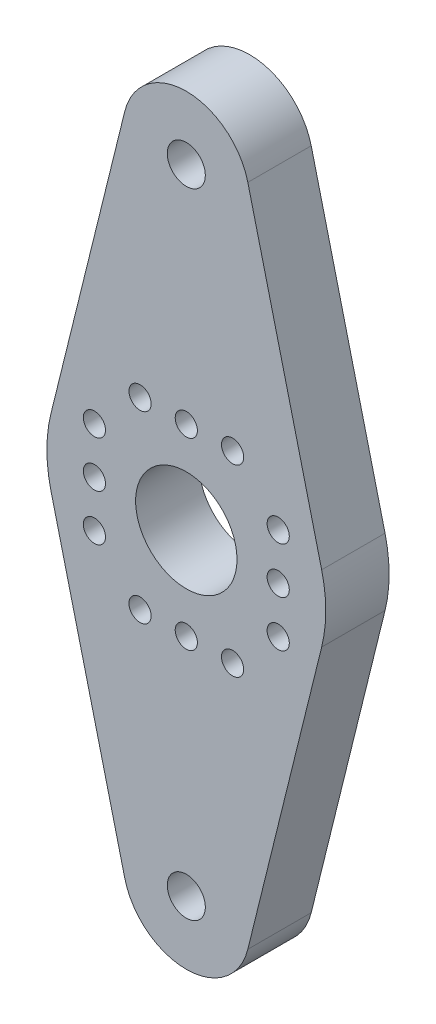
ISO-10303-21;
HEADER;
FILE_DESCRIPTION(('STEP AP214'),'2;1');
FILE_NAME('part.step','',(''),(''),'','','');
FILE_SCHEMA(('AUTOMOTIVE_DESIGN { 1 0 10303 214 1 1 1 1 }'));
ENDSEC;
DATA;
#1=APPLICATION_CONTEXT('core data for automotive mechanical design processes');
#2=APPLICATION_PROTOCOL_DEFINITION('international standard','automotive_design',2000,#1);
#3=PRODUCT_CONTEXT('',#1,'mechanical');
#4=PRODUCT('Part','Part','',(#3));
#5=PRODUCT_RELATED_PRODUCT_CATEGORY('part','',(#4));
#6=PRODUCT_DEFINITION_FORMATION('','',#4);
#7=PRODUCT_DEFINITION_CONTEXT('part definition',#1,'design');
#8=PRODUCT_DEFINITION('design','',#6,#7);
#9=PRODUCT_DEFINITION_SHAPE('','',#8);
#10=(LENGTH_UNIT() NAMED_UNIT(*) SI_UNIT(.MILLI.,.METRE.));
#11=(NAMED_UNIT(*) PLANE_ANGLE_UNIT() SI_UNIT($,.RADIAN.));
#12=(NAMED_UNIT(*) SI_UNIT($,.STERADIAN.) SOLID_ANGLE_UNIT());
#13=UNCERTAINTY_MEASURE_WITH_UNIT(LENGTH_MEASURE(1.E-05),#10,'distance_accuracy_value','');
#14=(GEOMETRIC_REPRESENTATION_CONTEXT(3) GLOBAL_UNCERTAINTY_ASSIGNED_CONTEXT((#13)) GLOBAL_UNIT_ASSIGNED_CONTEXT((#10,
#11,#12)) REPRESENTATION_CONTEXT('',''));
#15=CARTESIAN_POINT('',(0.,0.,0.));
#16=DIRECTION('',(0.,0.,1.));
#17=DIRECTION('',(1.,0.,0.));
#18=AXIS2_PLACEMENT_3D('',#15,#16,#17);
#19=CARTESIAN_POINT('',(0.,25.,5.));
#20=DIRECTION('',(0.,0.,-1.));
#21=DIRECTION('',(-1.,0.,0.));
#22=AXIS2_PLACEMENT_3D('',#19,#20,#21);
#23=PLANE('',#22);
#24=CARTESIAN_POINT('',(3.65,7.25,5.));
#25=DIRECTION('',(0.,0.,1.));
#26=DIRECTION('',(-1.,0.,0.));
#27=AXIS2_PLACEMENT_3D('',#24,#25,#26);
#28=CIRCLE('',#27,0.874999999999994);
#29=CARTESIAN_POINT('',(2.775,7.25,5.));
#30=VERTEX_POINT('',#29);
#31=EDGE_CURVE('E254',#30,#30,#28,.T.);
#32=ORIENTED_EDGE('',*,*,#31,.F.);
#33=EDGE_LOOP('',(#32));
#34=FACE_BOUND('',#33,.T.);
#35=CARTESIAN_POINT('',(0.,7.25,5.));
#36=DIRECTION('',(0.,0.,1.));
#37=DIRECTION('',(1.,0.,0.));
#38=AXIS2_PLACEMENT_3D('',#35,#36,#37);
#39=CIRCLE('',#38,0.875000000000001);
#40=CARTESIAN_POINT('',(0.875000000000077,7.25,5.));
#41=VERTEX_POINT('',#40);
#42=EDGE_CURVE('E242',#41,#41,#39,.T.);
#43=ORIENTED_EDGE('',*,*,#42,.F.);
#44=EDGE_LOOP('',(#43));
#45=FACE_BOUND('',#44,.T.);
#46=CARTESIAN_POINT('',(-7.25,-3.65,5.));
#47=DIRECTION('',(0.,0.,1.));
#48=DIRECTION('',(1.,0.,0.));
#49=AXIS2_PLACEMENT_3D('',#46,#47,#48);
#50=CIRCLE('',#49,0.874999999999999);
#51=CARTESIAN_POINT('',(-6.375,-3.65,5.));
#52=VERTEX_POINT('',#51);
#53=EDGE_CURVE('E230',#52,#52,#50,.T.);
#54=ORIENTED_EDGE('',*,*,#53,.F.);
#55=EDGE_LOOP('',(#54));
#56=FACE_BOUND('',#55,.T.);
#57=CARTESIAN_POINT('',(-3.65,-7.25,5.));
#58=DIRECTION('',(0.,0.,1.));
#59=DIRECTION('',(-1.,0.,0.));
#60=AXIS2_PLACEMENT_3D('',#57,#58,#59);
#61=CIRCLE('',#60,0.874999999999996);
#62=CARTESIAN_POINT('',(-4.525,-7.25,5.));
#63=VERTEX_POINT('',#62);
#64=EDGE_CURVE('E218',#63,#63,#61,.T.);
#65=ORIENTED_EDGE('',*,*,#64,.F.);
#66=EDGE_LOOP('',(#65));
#67=FACE_BOUND('',#66,.T.);
#68=CARTESIAN_POINT('',(0.,-7.25,5.));
#69=DIRECTION('',(0.,0.,1.));
#70=DIRECTION('',(1.,0.,0.));
#71=AXIS2_PLACEMENT_3D('',#68,#69,#70);
#72=CIRCLE('',#71,0.875);
#73=CARTESIAN_POINT('',(0.874999999999975,-7.25,5.));
#74=VERTEX_POINT('',#73);
#75=EDGE_CURVE('E206',#74,#74,#72,.T.);
#76=ORIENTED_EDGE('',*,*,#75,.F.);
#77=EDGE_LOOP('',(#76));
#78=FACE_BOUND('',#77,.T.);
#79=CARTESIAN_POINT('',(7.25,-3.65,5.));
#80=DIRECTION('',(0.,0.,1.));
#81=DIRECTION('',(-1.,0.,0.));
#82=AXIS2_PLACEMENT_3D('',#79,#80,#81);
#83=CIRCLE('',#82,0.874999999999997);
#84=CARTESIAN_POINT('',(6.375,-3.65,5.));
#85=VERTEX_POINT('',#84);
#86=EDGE_CURVE('E194',#85,#85,#83,.T.);
#87=ORIENTED_EDGE('',*,*,#86,.F.);
#88=EDGE_LOOP('',(#87));
#89=FACE_BOUND('',#88,.T.);
#90=CARTESIAN_POINT('',(7.25,0.,5.));
#91=DIRECTION('',(0.,0.,1.));
#92=DIRECTION('',(1.,0.,0.));
#93=AXIS2_PLACEMENT_3D('',#90,#91,#92);
#94=CIRCLE('',#93,0.874999999999999);
#95=CARTESIAN_POINT('',(8.125,0.,5.));
#96=VERTEX_POINT('',#95);
#97=EDGE_CURVE('E182',#96,#96,#94,.T.);
#98=ORIENTED_EDGE('',*,*,#97,.F.);
#99=EDGE_LOOP('',(#98));
#100=FACE_BOUND('',#99,.T.);
#101=CARTESIAN_POINT('',(0.,25.,5.));
#102=DIRECTION('',(0.,0.,1.));
#103=DIRECTION('',(-1.,0.,0.));
#104=AXIS2_PLACEMENT_3D('',#101,#102,#103);
#105=CIRCLE('',#104,5.);
#106=CARTESIAN_POINT('',(4.85386443980464,26.2,5.));
#107=VERTEX_POINT('',#106);
#108=CARTESIAN_POINT('',(-4.85386443980464,26.2,5.));
#109=VERTEX_POINT('',#108);
#110=EDGE_CURVE('E145',#107,#109,#105,.T.);
#111=ORIENTED_EDGE('',*,*,#110,.T.);
#112=DIRECTION('',(-0.24,-0.970772887960928,0.));
#113=VECTOR('',#112,1.);
#114=CARTESIAN_POINT('',(-10.6785017675702,2.64,5.));
#115=LINE('',#114,#113);
#116=CARTESIAN_POINT('',(-10.6785017675702,2.64,5.));
#117=VERTEX_POINT('',#116);
#118=EDGE_CURVE('E93',#109,#117,#115,.T.);
#119=ORIENTED_EDGE('',*,*,#118,.T.);
#120=CARTESIAN_POINT('',(0.,0.,5.));
#121=DIRECTION('',(0.,0.,1.));
#122=DIRECTION('',(-1.,0.,0.));
#123=AXIS2_PLACEMENT_3D('',#120,#121,#122);
#124=CIRCLE('',#123,11.);
#125=CARTESIAN_POINT('',(-10.6785017675702,-2.64,5.));
#126=VERTEX_POINT('',#125);
#127=EDGE_CURVE('E160',#117,#126,#124,.T.);
#128=ORIENTED_EDGE('',*,*,#127,.T.);
#129=DIRECTION('',(0.24,-0.970772887960928,0.));
#130=VECTOR('',#129,1.);
#131=CARTESIAN_POINT('',(-10.6785017675702,-2.64,5.));
#132=LINE('',#131,#130);
#133=CARTESIAN_POINT('',(-4.85386443980464,-26.2,5.));
#134=VERTEX_POINT('',#133);
#135=EDGE_CURVE('E173',#126,#134,#132,.T.);
#136=ORIENTED_EDGE('',*,*,#135,.T.);
#137=CARTESIAN_POINT('',(0.,-25.,5.));
#138=DIRECTION('',(0.,0.,1.));
#139=DIRECTION('',(1.,0.,0.));
#140=AXIS2_PLACEMENT_3D('',#137,#138,#139);
#141=CIRCLE('',#140,5.);
#142=CARTESIAN_POINT('',(4.85386443980464,-26.2,5.));
#143=VERTEX_POINT('',#142);
#144=EDGE_CURVE('E112',#134,#143,#141,.T.);
#145=ORIENTED_EDGE('',*,*,#144,.T.);
#146=DIRECTION('',(0.24,0.970772887960928,0.));
#147=VECTOR('',#146,1.);
#148=CARTESIAN_POINT('',(4.85386443980464,-26.2,5.));
#149=LINE('',#148,#147);
#150=CARTESIAN_POINT('',(10.6785017675702,-2.64,5.));
#151=VERTEX_POINT('',#150);
#152=EDGE_CURVE('E106',#143,#151,#149,.T.);
#153=ORIENTED_EDGE('',*,*,#152,.T.);
#154=CARTESIAN_POINT('',(0.,0.,5.));
#155=DIRECTION('',(0.,0.,1.));
#156=DIRECTION('',(1.,0.,0.));
#157=AXIS2_PLACEMENT_3D('',#154,#155,#156);
#158=CIRCLE('',#157,11.);
#159=CARTESIAN_POINT('',(10.6785017675702,2.64,5.));
#160=VERTEX_POINT('',#159);
#161=EDGE_CURVE('E110',#151,#160,#158,.T.);
#162=ORIENTED_EDGE('',*,*,#161,.T.);
#163=DIRECTION('',(-0.24,0.970772887960928,0.));
#164=VECTOR('',#163,1.);
#165=CARTESIAN_POINT('',(4.85386443980464,26.2,5.));
#166=LINE('',#165,#164);
#167=EDGE_CURVE('E50',#160,#107,#166,.T.);
#168=ORIENTED_EDGE('',*,*,#167,.T.);
#169=EDGE_LOOP('',(#111,#119,#128,#136,#145,#153,#162,#168));
#170=FACE_BOUND('',#169,.T.);
#171=CARTESIAN_POINT('',(0.,0.,5.));
#172=DIRECTION('',(0.,0.,1.));
#173=DIRECTION('',(1.,0.,0.));
#174=AXIS2_PLACEMENT_3D('',#171,#172,#173);
#175=CIRCLE('',#174,4.);
#176=CARTESIAN_POINT('',(4.,0.,5.));
#177=VERTEX_POINT('',#176);
#178=EDGE_CURVE('E134',#177,#177,#175,.T.);
#179=ORIENTED_EDGE('',*,*,#178,.F.);
#180=EDGE_LOOP('',(#179));
#181=FACE_BOUND('',#180,.T.);
#182=CARTESIAN_POINT('',(7.25,3.65,5.));
#183=DIRECTION('',(0.,0.,1.));
#184=DIRECTION('',(1.,0.,0.));
#185=AXIS2_PLACEMENT_3D('',#182,#183,#184);
#186=CIRCLE('',#185,0.874999999999999);
#187=CARTESIAN_POINT('',(8.125,3.65,5.));
#188=VERTEX_POINT('',#187);
#189=EDGE_CURVE('E188',#188,#188,#186,.T.);
#190=ORIENTED_EDGE('',*,*,#189,.F.);
#191=EDGE_LOOP('',(#190));
#192=FACE_BOUND('',#191,.T.);
#193=CARTESIAN_POINT('',(0.,25.,5.));
#194=DIRECTION('',(0.,0.,1.));
#195=DIRECTION('',(1.,0.,0.));
#196=AXIS2_PLACEMENT_3D('',#193,#194,#195);
#197=CIRCLE('',#196,1.5);
#198=CARTESIAN_POINT('',(1.5,25.,5.));
#199=VERTEX_POINT('',#198);
#200=EDGE_CURVE('E200',#199,#199,#197,.T.);
#201=ORIENTED_EDGE('',*,*,#200,.F.);
#202=EDGE_LOOP('',(#201));
#203=FACE_BOUND('',#202,.T.);
#204=CARTESIAN_POINT('',(3.65,-7.25,5.));
#205=DIRECTION('',(0.,0.,1.));
#206=DIRECTION('',(1.,0.,0.));
#207=AXIS2_PLACEMENT_3D('',#204,#205,#206);
#208=CIRCLE('',#207,0.874999999999999);
#209=CARTESIAN_POINT('',(4.525,-7.25,5.));
#210=VERTEX_POINT('',#209);
#211=EDGE_CURVE('E212',#210,#210,#208,.T.);
#212=ORIENTED_EDGE('',*,*,#211,.F.);
#213=EDGE_LOOP('',(#212));
#214=FACE_BOUND('',#213,.T.);
#215=CARTESIAN_POINT('',(-7.25,0.,5.));
#216=DIRECTION('',(0.,0.,1.));
#217=DIRECTION('',(1.,0.,0.));
#218=AXIS2_PLACEMENT_3D('',#215,#216,#217);
#219=CIRCLE('',#218,0.874999999999999);
#220=CARTESIAN_POINT('',(-6.375,0.,5.));
#221=VERTEX_POINT('',#220);
#222=EDGE_CURVE('E224',#221,#221,#219,.T.);
#223=ORIENTED_EDGE('',*,*,#222,.F.);
#224=EDGE_LOOP('',(#223));
#225=FACE_BOUND('',#224,.T.);
#226=CARTESIAN_POINT('',(-7.25,3.65,5.));
#227=DIRECTION('',(0.,0.,1.));
#228=DIRECTION('',(-1.,0.,0.));
#229=AXIS2_PLACEMENT_3D('',#226,#227,#228);
#230=CIRCLE('',#229,0.874999999999995);
#231=CARTESIAN_POINT('',(-8.12499999999999,3.65,5.));
#232=VERTEX_POINT('',#231);
#233=EDGE_CURVE('E236',#232,#232,#230,.T.);
#234=ORIENTED_EDGE('',*,*,#233,.F.);
#235=EDGE_LOOP('',(#234));
#236=FACE_BOUND('',#235,.T.);
#237=CARTESIAN_POINT('',(-3.65,7.25,5.));
#238=DIRECTION('',(0.,0.,1.));
#239=DIRECTION('',(1.,0.,0.));
#240=AXIS2_PLACEMENT_3D('',#237,#238,#239);
#241=CIRCLE('',#240,0.874999999999998);
#242=CARTESIAN_POINT('',(-2.775,7.25,5.));
#243=VERTEX_POINT('',#242);
#244=EDGE_CURVE('E248',#243,#243,#241,.T.);
#245=ORIENTED_EDGE('',*,*,#244,.F.);
#246=EDGE_LOOP('',(#245));
#247=FACE_BOUND('',#246,.T.);
#248=CARTESIAN_POINT('',(0.,-25.,5.));
#249=DIRECTION('',(0.,0.,1.));
#250=DIRECTION('',(-1.,0.,0.));
#251=AXIS2_PLACEMENT_3D('',#248,#249,#250);
#252=CIRCLE('',#251,1.5);
#253=CARTESIAN_POINT('',(-1.5,-25.,5.));
#254=VERTEX_POINT('',#253);
#255=EDGE_CURVE('E260',#254,#254,#252,.T.);
#256=ORIENTED_EDGE('',*,*,#255,.F.);
#257=EDGE_LOOP('',(#256));
#258=FACE_BOUND('',#257,.T.);
#259=ADVANCED_FACE('F33',(#34,#45,#56,#67,#78,#89,#100,#170,#181,#192,#203,#214,#225,#236,#247,
#258),#23,.F.);
#260=CARTESIAN_POINT('',(0.,25.,0.));
#261=DIRECTION('',(0.,0.,-1.));
#262=DIRECTION('',(-1.,0.,0.));
#263=AXIS2_PLACEMENT_3D('',#260,#261,#262);
#264=PLANE('',#263);
#265=CARTESIAN_POINT('',(3.65,7.25,0.));
#266=DIRECTION('',(0.,0.,1.));
#267=DIRECTION('',(-1.,0.,0.));
#268=AXIS2_PLACEMENT_3D('',#265,#266,#267);
#269=CIRCLE('',#268,0.874999999999994);
#270=CARTESIAN_POINT('',(2.775,7.25,0.));
#271=VERTEX_POINT('',#270);
#272=EDGE_CURVE('E257',#271,#271,#269,.T.);
#273=ORIENTED_EDGE('',*,*,#272,.T.);
#274=EDGE_LOOP('',(#273));
#275=FACE_BOUND('',#274,.T.);
#276=CARTESIAN_POINT('',(0.,7.25,0.));
#277=DIRECTION('',(0.,0.,1.));
#278=DIRECTION('',(1.,0.,0.));
#279=AXIS2_PLACEMENT_3D('',#276,#277,#278);
#280=CIRCLE('',#279,0.875000000000001);
#281=CARTESIAN_POINT('',(0.875000000000077,7.25,0.));
#282=VERTEX_POINT('',#281);
#283=EDGE_CURVE('E245',#282,#282,#280,.T.);
#284=ORIENTED_EDGE('',*,*,#283,.T.);
#285=EDGE_LOOP('',(#284));
#286=FACE_BOUND('',#285,.T.);
#287=CARTESIAN_POINT('',(-7.25,-3.65,0.));
#288=DIRECTION('',(0.,0.,1.));
#289=DIRECTION('',(1.,0.,0.));
#290=AXIS2_PLACEMENT_3D('',#287,#288,#289);
#291=CIRCLE('',#290,0.874999999999999);
#292=CARTESIAN_POINT('',(-6.375,-3.65,0.));
#293=VERTEX_POINT('',#292);
#294=EDGE_CURVE('E233',#293,#293,#291,.T.);
#295=ORIENTED_EDGE('',*,*,#294,.T.);
#296=EDGE_LOOP('',(#295));
#297=FACE_BOUND('',#296,.T.);
#298=CARTESIAN_POINT('',(-3.65,-7.25,0.));
#299=DIRECTION('',(0.,0.,1.));
#300=DIRECTION('',(-1.,0.,0.));
#301=AXIS2_PLACEMENT_3D('',#298,#299,#300);
#302=CIRCLE('',#301,0.874999999999996);
#303=CARTESIAN_POINT('',(-4.525,-7.25,0.));
#304=VERTEX_POINT('',#303);
#305=EDGE_CURVE('E221',#304,#304,#302,.T.);
#306=ORIENTED_EDGE('',*,*,#305,.T.);
#307=EDGE_LOOP('',(#306));
#308=FACE_BOUND('',#307,.T.);
#309=CARTESIAN_POINT('',(0.,-7.25,0.));
#310=DIRECTION('',(0.,0.,1.));
#311=DIRECTION('',(1.,0.,0.));
#312=AXIS2_PLACEMENT_3D('',#309,#310,#311);
#313=CIRCLE('',#312,0.875);
#314=CARTESIAN_POINT('',(0.874999999999975,-7.25,0.));
#315=VERTEX_POINT('',#314);
#316=EDGE_CURVE('E209',#315,#315,#313,.T.);
#317=ORIENTED_EDGE('',*,*,#316,.T.);
#318=EDGE_LOOP('',(#317));
#319=FACE_BOUND('',#318,.T.);
#320=CARTESIAN_POINT('',(7.25,-3.65,0.));
#321=DIRECTION('',(0.,0.,1.));
#322=DIRECTION('',(-1.,0.,0.));
#323=AXIS2_PLACEMENT_3D('',#320,#321,#322);
#324=CIRCLE('',#323,0.874999999999997);
#325=CARTESIAN_POINT('',(6.375,-3.65,0.));
#326=VERTEX_POINT('',#325);
#327=EDGE_CURVE('E197',#326,#326,#324,.T.);
#328=ORIENTED_EDGE('',*,*,#327,.T.);
#329=EDGE_LOOP('',(#328));
#330=FACE_BOUND('',#329,.T.);
#331=CARTESIAN_POINT('',(7.25,0.,0.));
#332=DIRECTION('',(0.,0.,1.));
#333=DIRECTION('',(1.,0.,0.));
#334=AXIS2_PLACEMENT_3D('',#331,#332,#333);
#335=CIRCLE('',#334,0.874999999999999);
#336=CARTESIAN_POINT('',(8.125,0.,0.));
#337=VERTEX_POINT('',#336);
#338=EDGE_CURVE('E185',#337,#337,#335,.T.);
#339=ORIENTED_EDGE('',*,*,#338,.T.);
#340=EDGE_LOOP('',(#339));
#341=FACE_BOUND('',#340,.T.);
#342=CARTESIAN_POINT('',(0.,25.,0.));
#343=DIRECTION('',(0.,0.,1.));
#344=DIRECTION('',(-1.,0.,0.));
#345=AXIS2_PLACEMENT_3D('',#342,#343,#344);
#346=CIRCLE('',#345,5.);
#347=CARTESIAN_POINT('',(4.85386443980464,26.2,0.));
#348=VERTEX_POINT('',#347);
#349=CARTESIAN_POINT('',(-4.85386443980464,26.2,0.));
#350=VERTEX_POINT('',#349);
#351=EDGE_CURVE('E130',#348,#350,#346,.T.);
#352=ORIENTED_EDGE('',*,*,#351,.F.);
#353=DIRECTION('',(-0.24,0.970772887960928,0.));
#354=VECTOR('',#353,1.);
#355=CARTESIAN_POINT('',(4.85386443980464,26.2,0.));
#356=LINE('',#355,#354);
#357=CARTESIAN_POINT('',(10.6785017675702,2.64,0.));
#358=VERTEX_POINT('',#357);
#359=EDGE_CURVE('E85',#358,#348,#356,.T.);
#360=ORIENTED_EDGE('',*,*,#359,.F.);
#361=CARTESIAN_POINT('',(0.,0.,0.));
#362=DIRECTION('',(0.,0.,1.));
#363=DIRECTION('',(1.,0.,0.));
#364=AXIS2_PLACEMENT_3D('',#361,#362,#363);
#365=CIRCLE('',#364,11.);
#366=CARTESIAN_POINT('',(10.6785017675702,-2.64,0.));
#367=VERTEX_POINT('',#366);
#368=EDGE_CURVE('E79',#367,#358,#365,.T.);
#369=ORIENTED_EDGE('',*,*,#368,.F.);
#370=DIRECTION('',(0.24,0.970772887960928,0.));
#371=VECTOR('',#370,1.);
#372=CARTESIAN_POINT('',(4.85386443980464,-26.2,0.));
#373=LINE('',#372,#371);
#374=CARTESIAN_POINT('',(4.85386443980464,-26.2,0.));
#375=VERTEX_POINT('',#374);
#376=EDGE_CURVE('E120',#375,#367,#373,.T.);
#377=ORIENTED_EDGE('',*,*,#376,.F.);
#378=CARTESIAN_POINT('',(0.,-25.,0.));
#379=DIRECTION('',(0.,0.,1.));
#380=DIRECTION('',(1.,0.,0.));
#381=AXIS2_PLACEMENT_3D('',#378,#379,#380);
#382=CIRCLE('',#381,5.);
#383=CARTESIAN_POINT('',(-4.85386443980464,-26.2,0.));
#384=VERTEX_POINT('',#383);
#385=EDGE_CURVE('E140',#384,#375,#382,.T.);
#386=ORIENTED_EDGE('',*,*,#385,.F.);
#387=DIRECTION('',(0.24,-0.970772887960928,0.));
#388=VECTOR('',#387,1.);
#389=CARTESIAN_POINT('',(-10.6785017675702,-2.64,0.));
#390=LINE('',#389,#388);
#391=CARTESIAN_POINT('',(-10.6785017675702,-2.64,0.));
#392=VERTEX_POINT('',#391);
#393=EDGE_CURVE('E138',#392,#384,#390,.T.);
#394=ORIENTED_EDGE('',*,*,#393,.F.);
#395=CARTESIAN_POINT('',(0.,0.,0.));
#396=DIRECTION('',(0.,0.,1.));
#397=DIRECTION('',(-1.,0.,0.));
#398=AXIS2_PLACEMENT_3D('',#395,#396,#397);
#399=CIRCLE('',#398,11.);
#400=CARTESIAN_POINT('',(-10.6785017675702,2.64,0.));
#401=VERTEX_POINT('',#400);
#402=EDGE_CURVE('E136',#401,#392,#399,.T.);
#403=ORIENTED_EDGE('',*,*,#402,.F.);
#404=DIRECTION('',(-0.24,-0.970772887960928,0.));
#405=VECTOR('',#404,1.);
#406=CARTESIAN_POINT('',(-10.6785017675702,2.64,0.));
#407=LINE('',#406,#405);
#408=EDGE_CURVE('E133',#350,#401,#407,.T.);
#409=ORIENTED_EDGE('',*,*,#408,.F.);
#410=EDGE_LOOP('',(#352,#360,#369,#377,#386,#394,#403,#409));
#411=FACE_BOUND('',#410,.T.);
#412=CARTESIAN_POINT('',(0.,0.,0.));
#413=DIRECTION('',(0.,0.,1.));
#414=DIRECTION('',(1.,0.,0.));
#415=AXIS2_PLACEMENT_3D('',#412,#413,#414);
#416=CIRCLE('',#415,4.);
#417=CARTESIAN_POINT('',(4.,0.,0.));
#418=VERTEX_POINT('',#417);
#419=EDGE_CURVE('E179',#418,#418,#416,.T.);
#420=ORIENTED_EDGE('',*,*,#419,.T.);
#421=EDGE_LOOP('',(#420));
#422=FACE_BOUND('',#421,.T.);
#423=CARTESIAN_POINT('',(7.25,3.65,0.));
#424=DIRECTION('',(0.,0.,1.));
#425=DIRECTION('',(1.,0.,0.));
#426=AXIS2_PLACEMENT_3D('',#423,#424,#425);
#427=CIRCLE('',#426,0.874999999999999);
#428=CARTESIAN_POINT('',(8.125,3.65,0.));
#429=VERTEX_POINT('',#428);
#430=EDGE_CURVE('E191',#429,#429,#427,.T.);
#431=ORIENTED_EDGE('',*,*,#430,.T.);
#432=EDGE_LOOP('',(#431));
#433=FACE_BOUND('',#432,.T.);
#434=CARTESIAN_POINT('',(0.,25.,0.));
#435=DIRECTION('',(0.,0.,1.));
#436=DIRECTION('',(1.,0.,0.));
#437=AXIS2_PLACEMENT_3D('',#434,#435,#436);
#438=CIRCLE('',#437,1.5);
#439=CARTESIAN_POINT('',(1.5,25.,0.));
#440=VERTEX_POINT('',#439);
#441=EDGE_CURVE('E203',#440,#440,#438,.T.);
#442=ORIENTED_EDGE('',*,*,#441,.T.);
#443=EDGE_LOOP('',(#442));
#444=FACE_BOUND('',#443,.T.);
#445=CARTESIAN_POINT('',(3.65,-7.25,0.));
#446=DIRECTION('',(0.,0.,1.));
#447=DIRECTION('',(1.,0.,0.));
#448=AXIS2_PLACEMENT_3D('',#445,#446,#447);
#449=CIRCLE('',#448,0.874999999999999);
#450=CARTESIAN_POINT('',(4.525,-7.25,0.));
#451=VERTEX_POINT('',#450);
#452=EDGE_CURVE('E215',#451,#451,#449,.T.);
#453=ORIENTED_EDGE('',*,*,#452,.T.);
#454=EDGE_LOOP('',(#453));
#455=FACE_BOUND('',#454,.T.);
#456=CARTESIAN_POINT('',(-7.25,0.,0.));
#457=DIRECTION('',(0.,0.,1.));
#458=DIRECTION('',(1.,0.,0.));
#459=AXIS2_PLACEMENT_3D('',#456,#457,#458);
#460=CIRCLE('',#459,0.874999999999999);
#461=CARTESIAN_POINT('',(-6.375,0.,0.));
#462=VERTEX_POINT('',#461);
#463=EDGE_CURVE('E227',#462,#462,#460,.T.);
#464=ORIENTED_EDGE('',*,*,#463,.T.);
#465=EDGE_LOOP('',(#464));
#466=FACE_BOUND('',#465,.T.);
#467=CARTESIAN_POINT('',(-7.25,3.65,0.));
#468=DIRECTION('',(0.,0.,1.));
#469=DIRECTION('',(-1.,0.,0.));
#470=AXIS2_PLACEMENT_3D('',#467,#468,#469);
#471=CIRCLE('',#470,0.874999999999995);
#472=CARTESIAN_POINT('',(-8.12499999999999,3.65,0.));
#473=VERTEX_POINT('',#472);
#474=EDGE_CURVE('E239',#473,#473,#471,.T.);
#475=ORIENTED_EDGE('',*,*,#474,.T.);
#476=EDGE_LOOP('',(#475));
#477=FACE_BOUND('',#476,.T.);
#478=CARTESIAN_POINT('',(-3.65,7.25,0.));
#479=DIRECTION('',(0.,0.,1.));
#480=DIRECTION('',(1.,0.,0.));
#481=AXIS2_PLACEMENT_3D('',#478,#479,#480);
#482=CIRCLE('',#481,0.874999999999998);
#483=CARTESIAN_POINT('',(-2.775,7.25,0.));
#484=VERTEX_POINT('',#483);
#485=EDGE_CURVE('E251',#484,#484,#482,.T.);
#486=ORIENTED_EDGE('',*,*,#485,.T.);
#487=EDGE_LOOP('',(#486));
#488=FACE_BOUND('',#487,.T.);
#489=CARTESIAN_POINT('',(0.,-25.,0.));
#490=DIRECTION('',(0.,0.,1.));
#491=DIRECTION('',(-1.,0.,0.));
#492=AXIS2_PLACEMENT_3D('',#489,#490,#491);
#493=CIRCLE('',#492,1.5);
#494=CARTESIAN_POINT('',(-1.5,-25.,0.));
#495=VERTEX_POINT('',#494);
#496=EDGE_CURVE('E263',#495,#495,#493,.T.);
#497=ORIENTED_EDGE('',*,*,#496,.T.);
#498=EDGE_LOOP('',(#497));
#499=FACE_BOUND('',#498,.T.);
#500=ADVANCED_FACE('F164',(#275,#286,#297,#308,#319,#330,#341,#411,#422,#433,#444,#455,#466,
#477,#488,#499),#264,.T.);
#501=CARTESIAN_POINT('',(0.,25.,5.));
#502=DIRECTION('',(0.,0.,-1.));
#503=DIRECTION('',(-1.,0.,0.));
#504=AXIS2_PLACEMENT_3D('',#501,#502,#503);
#505=CYLINDRICAL_SURFACE('',#504,5.);
#506=ORIENTED_EDGE('',*,*,#351,.T.);
#507=DIRECTION('',(0.,0.,-1.));
#508=VECTOR('',#507,1.);
#509=CARTESIAN_POINT('',(-4.85386443980464,26.2,5.));
#510=LINE('',#509,#508);
#511=EDGE_CURVE('E11',#109,#350,#510,.T.);
#512=ORIENTED_EDGE('',*,*,#511,.F.);
#513=ORIENTED_EDGE('',*,*,#110,.F.);
#514=DIRECTION('',(0.,0.,-1.));
#515=VECTOR('',#514,1.);
#516=CARTESIAN_POINT('',(4.85386443980464,26.2,5.));
#517=LINE('',#516,#515);
#518=EDGE_CURVE('E126',#107,#348,#517,.T.);
#519=ORIENTED_EDGE('',*,*,#518,.T.);
#520=EDGE_LOOP('',(#506,#512,#513,#519));
#521=FACE_BOUND('',#520,.T.);
#522=ADVANCED_FACE('F35',(#521),#505,.T.);
#523=CARTESIAN_POINT('',(-10.6785017675702,2.64,5.));
#524=DIRECTION('',(0.970772887960928,-0.24,0.));
#525=DIRECTION('',(0.24,0.970772887960928,0.));
#526=AXIS2_PLACEMENT_3D('',#523,#524,#525);
#527=PLANE('',#526);
#528=ORIENTED_EDGE('',*,*,#408,.T.);
#529=DIRECTION('',(0.,0.,-1.));
#530=VECTOR('',#529,1.);
#531=CARTESIAN_POINT('',(-10.6785017675702,2.64,5.));
#532=LINE('',#531,#530);
#533=EDGE_CURVE('E42',#117,#401,#532,.T.);
#534=ORIENTED_EDGE('',*,*,#533,.F.);
#535=ORIENTED_EDGE('',*,*,#118,.F.);
#536=ORIENTED_EDGE('',*,*,#511,.T.);
#537=EDGE_LOOP('',(#528,#534,#535,#536));
#538=FACE_BOUND('',#537,.T.);
#539=ADVANCED_FACE('F298',(#538),#527,.F.);
#540=CARTESIAN_POINT('',(0.,0.,5.));
#541=DIRECTION('',(0.,0.,-1.));
#542=DIRECTION('',(-1.,0.,0.));
#543=AXIS2_PLACEMENT_3D('',#540,#541,#542);
#544=CYLINDRICAL_SURFACE('',#543,11.);
#545=ORIENTED_EDGE('',*,*,#402,.T.);
#546=DIRECTION('',(0.,0.,-1.));
#547=VECTOR('',#546,1.);
#548=CARTESIAN_POINT('',(-10.6785017675702,-2.64,5.));
#549=LINE('',#548,#547);
#550=EDGE_CURVE('E152',#126,#392,#549,.T.);
#551=ORIENTED_EDGE('',*,*,#550,.F.);
#552=ORIENTED_EDGE('',*,*,#127,.F.);
#553=ORIENTED_EDGE('',*,*,#533,.T.);
#554=EDGE_LOOP('',(#545,#551,#552,#553));
#555=FACE_BOUND('',#554,.T.);
#556=ADVANCED_FACE('F158',(#555),#544,.T.);
#557=CARTESIAN_POINT('',(-10.6785017675702,-2.64,5.));
#558=DIRECTION('',(0.970772887960928,0.24,0.));
#559=DIRECTION('',(-0.24,0.970772887960928,0.));
#560=AXIS2_PLACEMENT_3D('',#557,#558,#559);
#561=PLANE('',#560);
#562=ORIENTED_EDGE('',*,*,#393,.T.);
#563=DIRECTION('',(0.,0.,-1.));
#564=VECTOR('',#563,1.);
#565=CARTESIAN_POINT('',(-4.85386443980464,-26.2,5.));
#566=LINE('',#565,#564);
#567=EDGE_CURVE('E149',#134,#384,#566,.T.);
#568=ORIENTED_EDGE('',*,*,#567,.F.);
#569=ORIENTED_EDGE('',*,*,#135,.F.);
#570=ORIENTED_EDGE('',*,*,#550,.T.);
#571=EDGE_LOOP('',(#562,#568,#569,#570));
#572=FACE_BOUND('',#571,.T.);
#573=ADVANCED_FACE('F169',(#572),#561,.F.);
#574=CARTESIAN_POINT('',(0.,-25.,5.));
#575=DIRECTION('',(0.,0.,-1.));
#576=DIRECTION('',(-1.,0.,0.));
#577=AXIS2_PLACEMENT_3D('',#574,#575,#576);
#578=CYLINDRICAL_SURFACE('',#577,5.);
#579=ORIENTED_EDGE('',*,*,#385,.T.);
#580=DIRECTION('',(0.,0.,-1.));
#581=VECTOR('',#580,1.);
#582=CARTESIAN_POINT('',(4.85386443980464,-26.2,5.));
#583=LINE('',#582,#581);
#584=EDGE_CURVE('E121',#143,#375,#583,.T.);
#585=ORIENTED_EDGE('',*,*,#584,.F.);
#586=ORIENTED_EDGE('',*,*,#144,.F.);
#587=ORIENTED_EDGE('',*,*,#567,.T.);
#588=EDGE_LOOP('',(#579,#585,#586,#587));
#589=FACE_BOUND('',#588,.T.);
#590=ADVANCED_FACE('F172',(#589),#578,.T.);
#591=CARTESIAN_POINT('',(4.85386443980464,-26.2,5.));
#592=DIRECTION('',(-0.970772887960928,0.24,0.));
#593=DIRECTION('',(-0.24,-0.970772887960928,0.));
#594=AXIS2_PLACEMENT_3D('',#591,#592,#593);
#595=PLANE('',#594);
#596=ORIENTED_EDGE('',*,*,#376,.T.);
#597=DIRECTION('',(0.,0.,-1.));
#598=VECTOR('',#597,1.);
#599=CARTESIAN_POINT('',(10.6785017675702,-2.64,5.));
#600=LINE('',#599,#598);
#601=EDGE_CURVE('E117',#151,#367,#600,.T.);
#602=ORIENTED_EDGE('',*,*,#601,.F.);
#603=ORIENTED_EDGE('',*,*,#152,.F.);
#604=ORIENTED_EDGE('',*,*,#584,.T.);
#605=EDGE_LOOP('',(#596,#602,#603,#604));
#606=FACE_BOUND('',#605,.T.);
#607=ADVANCED_FACE('F118',(#606),#595,.F.);
#608=CARTESIAN_POINT('',(0.,0.,5.));
#609=DIRECTION('',(0.,0.,-1.));
#610=DIRECTION('',(-1.,0.,0.));
#611=AXIS2_PLACEMENT_3D('',#608,#609,#610);
#612=CYLINDRICAL_SURFACE('',#611,11.);
#613=ORIENTED_EDGE('',*,*,#368,.T.);
#614=DIRECTION('',(0.,0.,-1.));
#615=VECTOR('',#614,1.);
#616=CARTESIAN_POINT('',(10.6785017675702,2.64,5.));
#617=LINE('',#616,#615);
#618=EDGE_CURVE('E122',#160,#358,#617,.T.);
#619=ORIENTED_EDGE('',*,*,#618,.F.);
#620=ORIENTED_EDGE('',*,*,#161,.F.);
#621=ORIENTED_EDGE('',*,*,#601,.T.);
#622=EDGE_LOOP('',(#613,#619,#620,#621));
#623=FACE_BOUND('',#622,.T.);
#624=ADVANCED_FACE('F124',(#623),#612,.T.);
#625=CARTESIAN_POINT('',(4.85386443980464,26.2,5.));
#626=DIRECTION('',(-0.970772887960928,-0.24,0.));
#627=DIRECTION('',(0.24,-0.970772887960928,0.));
#628=AXIS2_PLACEMENT_3D('',#625,#626,#627);
#629=PLANE('',#628);
#630=ORIENTED_EDGE('',*,*,#359,.T.);
#631=ORIENTED_EDGE('',*,*,#518,.F.);
#632=ORIENTED_EDGE('',*,*,#167,.F.);
#633=ORIENTED_EDGE('',*,*,#618,.T.);
#634=EDGE_LOOP('',(#630,#631,#632,#633));
#635=FACE_BOUND('',#634,.T.);
#636=ADVANCED_FACE('F286',(#635),#629,.F.);
#637=CARTESIAN_POINT('',(0.,0.,5.));
#638=DIRECTION('',(0.,0.,-1.));
#639=DIRECTION('',(-1.,0.,0.));
#640=AXIS2_PLACEMENT_3D('',#637,#638,#639);
#641=CYLINDRICAL_SURFACE('',#640,4.);
#642=ORIENTED_EDGE('',*,*,#178,.T.);
#643=EDGE_LOOP('',(#642));
#644=FACE_BOUND('',#643,.T.);
#645=ORIENTED_EDGE('',*,*,#419,.F.);
#646=EDGE_LOOP('',(#645));
#647=FACE_BOUND('',#646,.T.);
#648=ADVANCED_FACE('F283',(#644,#647),#641,.F.);
#649=CARTESIAN_POINT('',(7.25,0.,5.));
#650=DIRECTION('',(0.,0.,-1.));
#651=DIRECTION('',(-1.,0.,0.));
#652=AXIS2_PLACEMENT_3D('',#649,#650,#651);
#653=CYLINDRICAL_SURFACE('',#652,0.874999999999999);
#654=ORIENTED_EDGE('',*,*,#97,.T.);
#655=EDGE_LOOP('',(#654));
#656=FACE_BOUND('',#655,.T.);
#657=ORIENTED_EDGE('',*,*,#338,.F.);
#658=EDGE_LOOP('',(#657));
#659=FACE_BOUND('',#658,.T.);
#660=ADVANCED_FACE('F362',(#656,#659),#653,.F.);
#661=CARTESIAN_POINT('',(7.25,3.65,5.));
#662=DIRECTION('',(0.,0.,-1.));
#663=DIRECTION('',(-1.,0.,0.));
#664=AXIS2_PLACEMENT_3D('',#661,#662,#663);
#665=CYLINDRICAL_SURFACE('',#664,0.874999999999999);
#666=ORIENTED_EDGE('',*,*,#189,.T.);
#667=EDGE_LOOP('',(#666));
#668=FACE_BOUND('',#667,.T.);
#669=ORIENTED_EDGE('',*,*,#430,.F.);
#670=EDGE_LOOP('',(#669));
#671=FACE_BOUND('',#670,.T.);
#672=ADVANCED_FACE('F370',(#668,#671),#665,.F.);
#673=CARTESIAN_POINT('',(7.25,-3.65,5.));
#674=DIRECTION('',(0.,0.,-1.));
#675=DIRECTION('',(-1.,0.,0.));
#676=AXIS2_PLACEMENT_3D('',#673,#674,#675);
#677=CYLINDRICAL_SURFACE('',#676,0.874999999999997);
#678=ORIENTED_EDGE('',*,*,#86,.T.);
#679=EDGE_LOOP('',(#678));
#680=FACE_BOUND('',#679,.T.);
#681=ORIENTED_EDGE('',*,*,#327,.F.);
#682=EDGE_LOOP('',(#681));
#683=FACE_BOUND('',#682,.T.);
#684=ADVANCED_FACE('F378',(#680,#683),#677,.F.);
#685=CARTESIAN_POINT('',(0.,25.,5.));
#686=DIRECTION('',(0.,0.,-1.));
#687=DIRECTION('',(-1.,0.,0.));
#688=AXIS2_PLACEMENT_3D('',#685,#686,#687);
#689=CYLINDRICAL_SURFACE('',#688,1.5);
#690=ORIENTED_EDGE('',*,*,#200,.T.);
#691=EDGE_LOOP('',(#690));
#692=FACE_BOUND('',#691,.T.);
#693=ORIENTED_EDGE('',*,*,#441,.F.);
#694=EDGE_LOOP('',(#693));
#695=FACE_BOUND('',#694,.T.);
#696=ADVANCED_FACE('F387',(#692,#695),#689,.F.);
#697=CARTESIAN_POINT('',(0.,-7.25,5.));
#698=DIRECTION('',(0.,0.,-1.));
#699=DIRECTION('',(-1.,0.,0.));
#700=AXIS2_PLACEMENT_3D('',#697,#698,#699);
#701=CYLINDRICAL_SURFACE('',#700,0.875);
#702=ORIENTED_EDGE('',*,*,#75,.T.);
#703=EDGE_LOOP('',(#702));
#704=FACE_BOUND('',#703,.T.);
#705=ORIENTED_EDGE('',*,*,#316,.F.);
#706=EDGE_LOOP('',(#705));
#707=FACE_BOUND('',#706,.T.);
#708=ADVANCED_FACE('F396',(#704,#707),#701,.F.);
#709=CARTESIAN_POINT('',(3.65,-7.25,5.));
#710=DIRECTION('',(0.,0.,-1.));
#711=DIRECTION('',(-1.,0.,0.));
#712=AXIS2_PLACEMENT_3D('',#709,#710,#711);
#713=CYLINDRICAL_SURFACE('',#712,0.874999999999999);
#714=ORIENTED_EDGE('',*,*,#211,.T.);
#715=EDGE_LOOP('',(#714));
#716=FACE_BOUND('',#715,.T.);
#717=ORIENTED_EDGE('',*,*,#452,.F.);
#718=EDGE_LOOP('',(#717));
#719=FACE_BOUND('',#718,.T.);
#720=ADVANCED_FACE('F405',(#716,#719),#713,.F.);
#721=CARTESIAN_POINT('',(-3.65,-7.25,5.));
#722=DIRECTION('',(0.,0.,-1.));
#723=DIRECTION('',(-1.,0.,0.));
#724=AXIS2_PLACEMENT_3D('',#721,#722,#723);
#725=CYLINDRICAL_SURFACE('',#724,0.874999999999996);
#726=ORIENTED_EDGE('',*,*,#64,.T.);
#727=EDGE_LOOP('',(#726));
#728=FACE_BOUND('',#727,.T.);
#729=ORIENTED_EDGE('',*,*,#305,.F.);
#730=EDGE_LOOP('',(#729));
#731=FACE_BOUND('',#730,.T.);
#732=ADVANCED_FACE('F414',(#728,#731),#725,.F.);
#733=CARTESIAN_POINT('',(-7.25,0.,5.));
#734=DIRECTION('',(0.,0.,-1.));
#735=DIRECTION('',(-1.,0.,0.));
#736=AXIS2_PLACEMENT_3D('',#733,#734,#735);
#737=CYLINDRICAL_SURFACE('',#736,0.874999999999999);
#738=ORIENTED_EDGE('',*,*,#222,.T.);
#739=EDGE_LOOP('',(#738));
#740=FACE_BOUND('',#739,.T.);
#741=ORIENTED_EDGE('',*,*,#463,.F.);
#742=EDGE_LOOP('',(#741));
#743=FACE_BOUND('',#742,.T.);
#744=ADVANCED_FACE('F423',(#740,#743),#737,.F.);
#745=CARTESIAN_POINT('',(-7.25,-3.65,5.));
#746=DIRECTION('',(0.,0.,-1.));
#747=DIRECTION('',(-1.,0.,0.));
#748=AXIS2_PLACEMENT_3D('',#745,#746,#747);
#749=CYLINDRICAL_SURFACE('',#748,0.874999999999999);
#750=ORIENTED_EDGE('',*,*,#53,.T.);
#751=EDGE_LOOP('',(#750));
#752=FACE_BOUND('',#751,.T.);
#753=ORIENTED_EDGE('',*,*,#294,.F.);
#754=EDGE_LOOP('',(#753));
#755=FACE_BOUND('',#754,.T.);
#756=ADVANCED_FACE('F432',(#752,#755),#749,.F.);
#757=CARTESIAN_POINT('',(-7.25,3.65,5.));
#758=DIRECTION('',(0.,0.,-1.));
#759=DIRECTION('',(-1.,0.,0.));
#760=AXIS2_PLACEMENT_3D('',#757,#758,#759);
#761=CYLINDRICAL_SURFACE('',#760,0.874999999999995);
#762=ORIENTED_EDGE('',*,*,#233,.T.);
#763=EDGE_LOOP('',(#762));
#764=FACE_BOUND('',#763,.T.);
#765=ORIENTED_EDGE('',*,*,#474,.F.);
#766=EDGE_LOOP('',(#765));
#767=FACE_BOUND('',#766,.T.);
#768=ADVANCED_FACE('F441',(#764,#767),#761,.F.);
#769=CARTESIAN_POINT('',(0.,7.25,5.));
#770=DIRECTION('',(0.,0.,-1.));
#771=DIRECTION('',(-1.,0.,0.));
#772=AXIS2_PLACEMENT_3D('',#769,#770,#771);
#773=CYLINDRICAL_SURFACE('',#772,0.875000000000001);
#774=ORIENTED_EDGE('',*,*,#42,.T.);
#775=EDGE_LOOP('',(#774));
#776=FACE_BOUND('',#775,.T.);
#777=ORIENTED_EDGE('',*,*,#283,.F.);
#778=EDGE_LOOP('',(#777));
#779=FACE_BOUND('',#778,.T.);
#780=ADVANCED_FACE('F450',(#776,#779),#773,.F.);
#781=CARTESIAN_POINT('',(-3.65,7.25,5.));
#782=DIRECTION('',(0.,0.,-1.));
#783=DIRECTION('',(-1.,0.,0.));
#784=AXIS2_PLACEMENT_3D('',#781,#782,#783);
#785=CYLINDRICAL_SURFACE('',#784,0.874999999999998);
#786=ORIENTED_EDGE('',*,*,#244,.T.);
#787=EDGE_LOOP('',(#786));
#788=FACE_BOUND('',#787,.T.);
#789=ORIENTED_EDGE('',*,*,#485,.F.);
#790=EDGE_LOOP('',(#789));
#791=FACE_BOUND('',#790,.T.);
#792=ADVANCED_FACE('F459',(#788,#791),#785,.F.);
#793=CARTESIAN_POINT('',(3.65,7.25,5.));
#794=DIRECTION('',(0.,0.,-1.));
#795=DIRECTION('',(-1.,0.,0.));
#796=AXIS2_PLACEMENT_3D('',#793,#794,#795);
#797=CYLINDRICAL_SURFACE('',#796,0.874999999999994);
#798=ORIENTED_EDGE('',*,*,#31,.T.);
#799=EDGE_LOOP('',(#798));
#800=FACE_BOUND('',#799,.T.);
#801=ORIENTED_EDGE('',*,*,#272,.F.);
#802=EDGE_LOOP('',(#801));
#803=FACE_BOUND('',#802,.T.);
#804=ADVANCED_FACE('F468',(#800,#803),#797,.F.);
#805=CARTESIAN_POINT('',(0.,-25.,5.));
#806=DIRECTION('',(0.,0.,-1.));
#807=DIRECTION('',(-1.,0.,0.));
#808=AXIS2_PLACEMENT_3D('',#805,#806,#807);
#809=CYLINDRICAL_SURFACE('',#808,1.5);
#810=ORIENTED_EDGE('',*,*,#255,.T.);
#811=EDGE_LOOP('',(#810));
#812=FACE_BOUND('',#811,.T.);
#813=ORIENTED_EDGE('',*,*,#496,.F.);
#814=EDGE_LOOP('',(#813));
#815=FACE_BOUND('',#814,.T.);
#816=ADVANCED_FACE('F269',(#812,#815),#809,.F.);
#817=CLOSED_SHELL('',(#259,#500,#522,#539,#556,#573,#590,#607,#624,#636,#648,#660,#672,#684,
#696,#708,#720,#732,#744,#756,#768,#780,#792,#804,#816));
#818=MANIFOLD_SOLID_BREP('B2',#817);
#819=ADVANCED_BREP_SHAPE_REPRESENTATION('',(#18,#818),#14);
#820=SHAPE_DEFINITION_REPRESENTATION(#9,#819);
ENDSEC;
END-ISO-10303-21;
